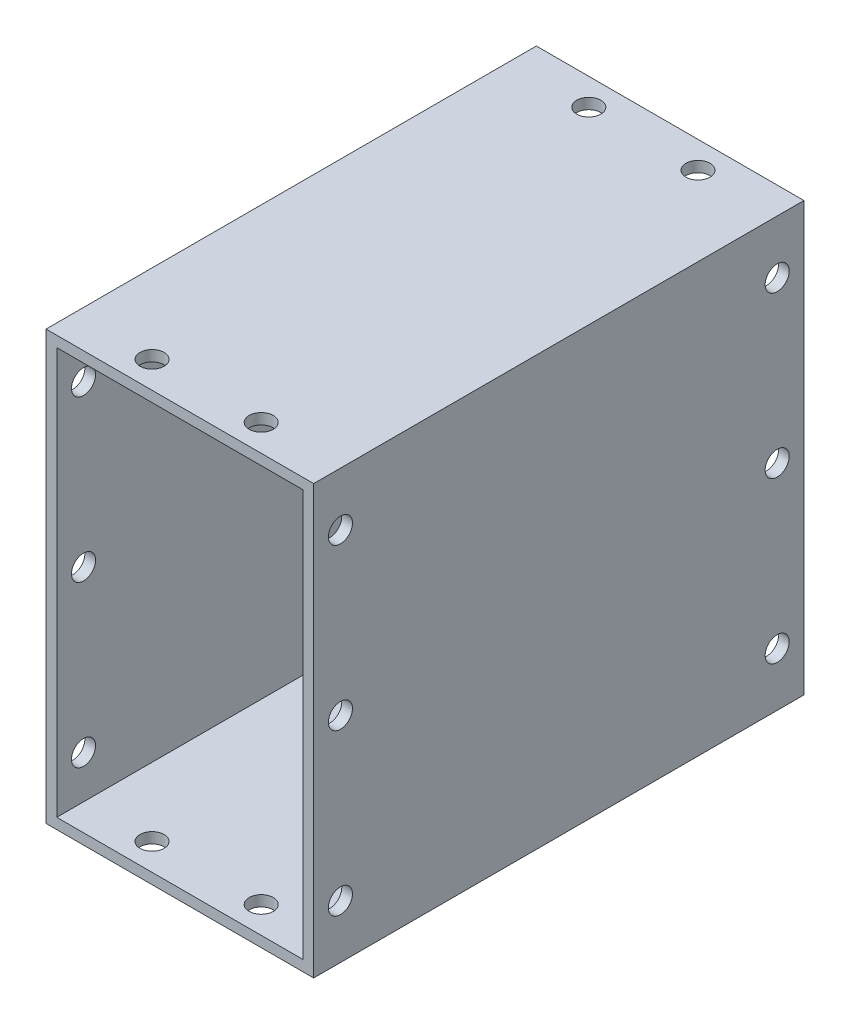
ISO-10303-21;
HEADER;
FILE_DESCRIPTION(('STEP AP214'),'2;1');
FILE_NAME('part.step','',(''),(''),'','','');
FILE_SCHEMA(('AUTOMOTIVE_DESIGN { 1 0 10303 214 1 1 1 1 }'));
ENDSEC;
DATA;
#1=APPLICATION_CONTEXT('core data for automotive mechanical design processes');
#2=APPLICATION_PROTOCOL_DEFINITION('international standard','automotive_design',2000,#1);
#3=PRODUCT_CONTEXT('',#1,'mechanical');
#4=PRODUCT('Part','Part','',(#3));
#5=PRODUCT_RELATED_PRODUCT_CATEGORY('part','',(#4));
#6=PRODUCT_DEFINITION_FORMATION('','',#4);
#7=PRODUCT_DEFINITION_CONTEXT('part definition',#1,'design');
#8=PRODUCT_DEFINITION('design','',#6,#7);
#9=PRODUCT_DEFINITION_SHAPE('','',#8);
#10=(LENGTH_UNIT() NAMED_UNIT(*) SI_UNIT(.MILLI.,.METRE.));
#11=(NAMED_UNIT(*) PLANE_ANGLE_UNIT() SI_UNIT($,.RADIAN.));
#12=(NAMED_UNIT(*) SI_UNIT($,.STERADIAN.) SOLID_ANGLE_UNIT());
#13=UNCERTAINTY_MEASURE_WITH_UNIT(LENGTH_MEASURE(1.E-05),#10,'distance_accuracy_value','');
#14=(GEOMETRIC_REPRESENTATION_CONTEXT(3) GLOBAL_UNCERTAINTY_ASSIGNED_CONTEXT((#13)) GLOBAL_UNIT_ASSIGNED_CONTEXT((#10,
#11,#12)) REPRESENTATION_CONTEXT('',''));
#15=CARTESIAN_POINT('',(0.,0.,0.));
#16=DIRECTION('',(0.,0.,1.));
#17=DIRECTION('',(1.,0.,0.));
#18=AXIS2_PLACEMENT_3D('',#15,#16,#17);
#19=CARTESIAN_POINT('',(25.,40.,151.6));
#20=DIRECTION('',(-1.,0.,0.));
#21=DIRECTION('',(0.,-1.,0.));
#22=AXIS2_PLACEMENT_3D('',#19,#20,#21);
#23=PLANE('',#22);
#24=DIRECTION('',(0.,1.,0.));
#25=VECTOR('',#24,1.);
#26=CARTESIAN_POINT('',(25.,40.,60.));
#27=LINE('',#26,#25);
#28=CARTESIAN_POINT('',(25.,-40.,60.));
#29=VERTEX_POINT('',#28);
#30=CARTESIAN_POINT('',(25.,40.,60.));
#31=VERTEX_POINT('',#30);
#32=EDGE_CURVE('E130',#29,#31,#27,.T.);
#33=ORIENTED_EDGE('',*,*,#32,.T.);
#34=DIRECTION('',(0.,0.,-1.));
#35=VECTOR('',#34,1.);
#36=CARTESIAN_POINT('',(25.,40.,151.6));
#37=LINE('',#36,#35);
#38=CARTESIAN_POINT('',(25.,40.,151.6));
#39=VERTEX_POINT('',#38);
#40=EDGE_CURVE('E11',#39,#31,#37,.T.);
#41=ORIENTED_EDGE('',*,*,#40,.F.);
#42=DIRECTION('',(0.,1.,0.));
#43=VECTOR('',#42,1.);
#44=CARTESIAN_POINT('',(25.,40.,151.6));
#45=LINE('',#44,#43);
#46=CARTESIAN_POINT('',(25.,-40.,151.6));
#47=VERTEX_POINT('',#46);
#48=EDGE_CURVE('E164',#47,#39,#45,.T.);
#49=ORIENTED_EDGE('',*,*,#48,.F.);
#50=DIRECTION('',(0.,0.,-1.));
#51=VECTOR('',#50,1.);
#52=CARTESIAN_POINT('',(25.,-40.,151.6));
#53=LINE('',#52,#51);
#54=EDGE_CURVE('E178',#47,#29,#53,.T.);
#55=ORIENTED_EDGE('',*,*,#54,.T.);
#56=EDGE_LOOP('',(#33,#41,#49,#55));
#57=FACE_BOUND('',#56,.T.);
#58=CARTESIAN_POINT('',(25.,30.,146.6));
#59=DIRECTION('',(1.,0.,0.));
#60=DIRECTION('',(0.,0.,-1.));
#61=AXIS2_PLACEMENT_3D('',#58,#59,#60);
#62=CIRCLE('',#61,2.24999999999999);
#63=CARTESIAN_POINT('',(25.,30.,144.35));
#64=VERTEX_POINT('',#63);
#65=EDGE_CURVE('E328',#64,#64,#62,.T.);
#66=ORIENTED_EDGE('',*,*,#65,.F.);
#67=EDGE_LOOP('',(#66));
#68=FACE_BOUND('',#67,.T.);
#69=CARTESIAN_POINT('',(25.,0.,146.6));
#70=DIRECTION('',(1.,0.,0.));
#71=DIRECTION('',(0.,0.,-1.));
#72=AXIS2_PLACEMENT_3D('',#69,#70,#71);
#73=CIRCLE('',#72,2.24999999999999);
#74=CARTESIAN_POINT('',(25.,0.,144.35));
#75=VERTEX_POINT('',#74);
#76=EDGE_CURVE('E320',#75,#75,#73,.T.);
#77=ORIENTED_EDGE('',*,*,#76,.F.);
#78=EDGE_LOOP('',(#77));
#79=FACE_BOUND('',#78,.T.);
#80=CARTESIAN_POINT('',(25.,-30.,146.6));
#81=DIRECTION('',(1.,0.,0.));
#82=DIRECTION('',(0.,0.,-1.));
#83=AXIS2_PLACEMENT_3D('',#80,#81,#82);
#84=CIRCLE('',#83,2.24999999999999);
#85=CARTESIAN_POINT('',(25.,-30.,144.35));
#86=VERTEX_POINT('',#85);
#87=EDGE_CURVE('E312',#86,#86,#84,.T.);
#88=ORIENTED_EDGE('',*,*,#87,.F.);
#89=EDGE_LOOP('',(#88));
#90=FACE_BOUND('',#89,.T.);
#91=CARTESIAN_POINT('',(25.,-30.,65.));
#92=DIRECTION('',(1.,0.,0.));
#93=DIRECTION('',(0.,0.,-1.));
#94=AXIS2_PLACEMENT_3D('',#91,#92,#93);
#95=CIRCLE('',#94,2.24999999999999);
#96=CARTESIAN_POINT('',(25.,-30.,62.75));
#97=VERTEX_POINT('',#96);
#98=EDGE_CURVE('E435',#97,#97,#95,.T.);
#99=ORIENTED_EDGE('',*,*,#98,.F.);
#100=EDGE_LOOP('',(#99));
#101=FACE_BOUND('',#100,.T.);
#102=CARTESIAN_POINT('',(25.,0.,65.));
#103=DIRECTION('',(1.,0.,0.));
#104=DIRECTION('',(0.,0.,-1.));
#105=AXIS2_PLACEMENT_3D('',#102,#103,#104);
#106=CIRCLE('',#105,2.24999999999999);
#107=CARTESIAN_POINT('',(25.,0.,62.75));
#108=VERTEX_POINT('',#107);
#109=EDGE_CURVE('E439',#108,#108,#106,.T.);
#110=ORIENTED_EDGE('',*,*,#109,.F.);
#111=EDGE_LOOP('',(#110));
#112=FACE_BOUND('',#111,.T.);
#113=CARTESIAN_POINT('',(25.,30.,65.));
#114=DIRECTION('',(1.,0.,0.));
#115=DIRECTION('',(0.,0.,-1.));
#116=AXIS2_PLACEMENT_3D('',#113,#114,#115);
#117=CIRCLE('',#116,2.24999999999999);
#118=CARTESIAN_POINT('',(25.,30.,62.75));
#119=VERTEX_POINT('',#118);
#120=EDGE_CURVE('E442',#119,#119,#117,.T.);
#121=ORIENTED_EDGE('',*,*,#120,.F.);
#122=EDGE_LOOP('',(#121));
#123=FACE_BOUND('',#122,.T.);
#124=ADVANCED_FACE('F47',(#57,#68,#79,#90,#101,#112,#123),#23,.F.);
#125=CARTESIAN_POINT('',(-25.,-40.,151.6));
#126=DIRECTION('',(0.,1.,0.));
#127=DIRECTION('',(0.,0.,1.));
#128=AXIS2_PLACEMENT_3D('',#125,#126,#127);
#129=PLANE('',#128);
#130=DIRECTION('',(1.,0.,0.));
#131=VECTOR('',#130,1.);
#132=CARTESIAN_POINT('',(-25.,-40.,60.));
#133=LINE('',#132,#131);
#134=CARTESIAN_POINT('',(-25.,-40.,60.));
#135=VERTEX_POINT('',#134);
#136=EDGE_CURVE('E169',#135,#29,#133,.T.);
#137=ORIENTED_EDGE('',*,*,#136,.T.);
#138=ORIENTED_EDGE('',*,*,#54,.F.);
#139=DIRECTION('',(1.,0.,0.));
#140=VECTOR('',#139,1.);
#141=CARTESIAN_POINT('',(-25.,-40.,151.6));
#142=LINE('',#141,#140);
#143=CARTESIAN_POINT('',(-25.,-40.,151.6));
#144=VERTEX_POINT('',#143);
#145=EDGE_CURVE('E175',#144,#47,#142,.T.);
#146=ORIENTED_EDGE('',*,*,#145,.F.);
#147=DIRECTION('',(0.,0.,-1.));
#148=VECTOR('',#147,1.);
#149=CARTESIAN_POINT('',(-25.,-40.,151.6));
#150=LINE('',#149,#148);
#151=EDGE_CURVE('E193',#144,#135,#150,.T.);
#152=ORIENTED_EDGE('',*,*,#151,.T.);
#153=EDGE_LOOP('',(#137,#138,#146,#152));
#154=FACE_BOUND('',#153,.T.);
#155=CARTESIAN_POINT('',(10.2,-40.,146.6));
#156=DIRECTION('',(0.,-1.,0.));
#157=DIRECTION('',(0.,0.,-1.));
#158=AXIS2_PLACEMENT_3D('',#155,#156,#157);
#159=CIRCLE('',#158,2.24999999999999);
#160=CARTESIAN_POINT('',(10.2,-40.,144.35));
#161=VERTEX_POINT('',#160);
#162=EDGE_CURVE('E280',#161,#161,#159,.T.);
#163=ORIENTED_EDGE('',*,*,#162,.F.);
#164=EDGE_LOOP('',(#163));
#165=FACE_BOUND('',#164,.T.);
#166=CARTESIAN_POINT('',(-10.2,-40.,146.6));
#167=DIRECTION('',(0.,-1.,0.));
#168=DIRECTION('',(0.,0.,-1.));
#169=AXIS2_PLACEMENT_3D('',#166,#167,#168);
#170=CIRCLE('',#169,2.24999999999999);
#171=CARTESIAN_POINT('',(-10.2,-40.,144.35));
#172=VERTEX_POINT('',#171);
#173=EDGE_CURVE('E272',#172,#172,#170,.T.);
#174=ORIENTED_EDGE('',*,*,#173,.F.);
#175=EDGE_LOOP('',(#174));
#176=FACE_BOUND('',#175,.T.);
#177=CARTESIAN_POINT('',(-10.2,-40.,65.));
#178=DIRECTION('',(0.,-1.,0.));
#179=DIRECTION('',(0.,0.,-1.));
#180=AXIS2_PLACEMENT_3D('',#177,#178,#179);
#181=CIRCLE('',#180,2.24999999999999);
#182=CARTESIAN_POINT('',(-10.2,-40.,62.75));
#183=VERTEX_POINT('',#182);
#184=EDGE_CURVE('E472',#183,#183,#181,.T.);
#185=ORIENTED_EDGE('',*,*,#184,.F.);
#186=EDGE_LOOP('',(#185));
#187=FACE_BOUND('',#186,.T.);
#188=CARTESIAN_POINT('',(10.2,-40.,65.));
#189=DIRECTION('',(0.,-1.,0.));
#190=DIRECTION('',(0.,0.,-1.));
#191=AXIS2_PLACEMENT_3D('',#188,#189,#190);
#192=CIRCLE('',#191,2.24999999999999);
#193=CARTESIAN_POINT('',(10.2,-40.,62.75));
#194=VERTEX_POINT('',#193);
#195=EDGE_CURVE('E464',#194,#194,#192,.T.);
#196=ORIENTED_EDGE('',*,*,#195,.F.);
#197=EDGE_LOOP('',(#196));
#198=FACE_BOUND('',#197,.T.);
#199=ADVANCED_FACE('F214',(#154,#165,#176,#187,#198),#129,.F.);
#200=CARTESIAN_POINT('',(-25.,40.,151.6));
#201=DIRECTION('',(1.,0.,0.));
#202=DIRECTION('',(0.,1.,0.));
#203=AXIS2_PLACEMENT_3D('',#200,#201,#202);
#204=PLANE('',#203);
#205=DIRECTION('',(0.,-1.,0.));
#206=VECTOR('',#205,1.);
#207=CARTESIAN_POINT('',(-25.,40.,60.));
#208=LINE('',#207,#206);
#209=CARTESIAN_POINT('',(-25.,40.,60.));
#210=VERTEX_POINT('',#209);
#211=EDGE_CURVE('E185',#210,#135,#208,.T.);
#212=ORIENTED_EDGE('',*,*,#211,.T.);
#213=ORIENTED_EDGE('',*,*,#151,.F.);
#214=DIRECTION('',(0.,-1.,0.));
#215=VECTOR('',#214,1.);
#216=CARTESIAN_POINT('',(-25.,40.,151.6));
#217=LINE('',#216,#215);
#218=CARTESIAN_POINT('',(-25.,40.,151.6));
#219=VERTEX_POINT('',#218);
#220=EDGE_CURVE('E172',#219,#144,#217,.T.);
#221=ORIENTED_EDGE('',*,*,#220,.F.);
#222=DIRECTION('',(0.,0.,-1.));
#223=VECTOR('',#222,1.);
#224=CARTESIAN_POINT('',(-25.,40.,151.6));
#225=LINE('',#224,#223);
#226=EDGE_CURVE('E55',#219,#210,#225,.T.);
#227=ORIENTED_EDGE('',*,*,#226,.T.);
#228=EDGE_LOOP('',(#212,#213,#221,#227));
#229=FACE_BOUND('',#228,.T.);
#230=CARTESIAN_POINT('',(-25.,-30.,146.6));
#231=DIRECTION('',(-1.,0.,0.));
#232=DIRECTION('',(0.,0.,1.));
#233=AXIS2_PLACEMENT_3D('',#230,#231,#232);
#234=CIRCLE('',#233,2.24999999999999);
#235=CARTESIAN_POINT('',(-25.,-30.,148.85));
#236=VERTEX_POINT('',#235);
#237=EDGE_CURVE('E304',#236,#236,#234,.T.);
#238=ORIENTED_EDGE('',*,*,#237,.F.);
#239=EDGE_LOOP('',(#238));
#240=FACE_BOUND('',#239,.T.);
#241=CARTESIAN_POINT('',(-25.,0.,146.6));
#242=DIRECTION('',(-1.,0.,0.));
#243=DIRECTION('',(0.,0.,1.));
#244=AXIS2_PLACEMENT_3D('',#241,#242,#243);
#245=CIRCLE('',#244,2.24999999999999);
#246=CARTESIAN_POINT('',(-25.,0.,148.85));
#247=VERTEX_POINT('',#246);
#248=EDGE_CURVE('E296',#247,#247,#245,.T.);
#249=ORIENTED_EDGE('',*,*,#248,.F.);
#250=EDGE_LOOP('',(#249));
#251=FACE_BOUND('',#250,.T.);
#252=CARTESIAN_POINT('',(-25.,30.,146.6));
#253=DIRECTION('',(-1.,0.,0.));
#254=DIRECTION('',(0.,0.,1.));
#255=AXIS2_PLACEMENT_3D('',#252,#253,#254);
#256=CIRCLE('',#255,2.24999999999999);
#257=CARTESIAN_POINT('',(-25.,30.,148.85));
#258=VERTEX_POINT('',#257);
#259=EDGE_CURVE('E288',#258,#258,#256,.T.);
#260=ORIENTED_EDGE('',*,*,#259,.F.);
#261=EDGE_LOOP('',(#260));
#262=FACE_BOUND('',#261,.T.);
#263=CARTESIAN_POINT('',(-25.,0.,65.));
#264=DIRECTION('',(-1.,0.,0.));
#265=DIRECTION('',(0.,0.,1.));
#266=AXIS2_PLACEMENT_3D('',#263,#264,#265);
#267=CIRCLE('',#266,2.24999999999999);
#268=CARTESIAN_POINT('',(-25.,0.,67.25));
#269=VERTEX_POINT('',#268);
#270=EDGE_CURVE('E248',#269,#269,#267,.T.);
#271=ORIENTED_EDGE('',*,*,#270,.F.);
#272=EDGE_LOOP('',(#271));
#273=FACE_BOUND('',#272,.T.);
#274=CARTESIAN_POINT('',(-25.,30.,65.));
#275=DIRECTION('',(-1.,0.,0.));
#276=DIRECTION('',(0.,0.,1.));
#277=AXIS2_PLACEMENT_3D('',#274,#275,#276);
#278=CIRCLE('',#277,2.24999999999999);
#279=CARTESIAN_POINT('',(-25.,30.,67.25));
#280=VERTEX_POINT('',#279);
#281=EDGE_CURVE('E488',#280,#280,#278,.T.);
#282=ORIENTED_EDGE('',*,*,#281,.F.);
#283=EDGE_LOOP('',(#282));
#284=FACE_BOUND('',#283,.T.);
#285=CARTESIAN_POINT('',(-25.,-30.,65.));
#286=DIRECTION('',(-1.,0.,0.));
#287=DIRECTION('',(0.,0.,1.));
#288=AXIS2_PLACEMENT_3D('',#285,#286,#287);
#289=CIRCLE('',#288,2.24999999999999);
#290=CARTESIAN_POINT('',(-25.,-30.,67.25));
#291=VERTEX_POINT('',#290);
#292=EDGE_CURVE('E480',#291,#291,#289,.T.);
#293=ORIENTED_EDGE('',*,*,#292,.F.);
#294=EDGE_LOOP('',(#293));
#295=FACE_BOUND('',#294,.T.);
#296=ADVANCED_FACE('F203',(#229,#240,#251,#262,#273,#284,#295),#204,.F.);
#297=CARTESIAN_POINT('',(-25.,40.,151.6));
#298=DIRECTION('',(0.,-1.,0.));
#299=DIRECTION('',(0.,0.,-1.));
#300=AXIS2_PLACEMENT_3D('',#297,#298,#299);
#301=PLANE('',#300);
#302=CARTESIAN_POINT('',(-10.2,40.,146.6));
#303=DIRECTION('',(0.,1.,0.));
#304=DIRECTION('',(0.,0.,1.));
#305=AXIS2_PLACEMENT_3D('',#302,#303,#304);
#306=CIRCLE('',#305,2.24999999999999);
#307=CARTESIAN_POINT('',(-10.2,40.,148.85));
#308=VERTEX_POINT('',#307);
#309=EDGE_CURVE('E264',#308,#308,#306,.T.);
#310=ORIENTED_EDGE('',*,*,#309,.F.);
#311=EDGE_LOOP('',(#310));
#312=FACE_BOUND('',#311,.T.);
#313=DIRECTION('',(-1.,0.,0.));
#314=VECTOR('',#313,1.);
#315=CARTESIAN_POINT('',(-25.,40.,60.));
#316=LINE('',#315,#314);
#317=EDGE_CURVE('E182',#31,#210,#316,.T.);
#318=ORIENTED_EDGE('',*,*,#317,.T.);
#319=ORIENTED_EDGE('',*,*,#226,.F.);
#320=DIRECTION('',(-1.,0.,0.));
#321=VECTOR('',#320,1.);
#322=CARTESIAN_POINT('',(-25.,40.,151.6));
#323=LINE('',#322,#321);
#324=EDGE_CURVE('E168',#39,#219,#323,.T.);
#325=ORIENTED_EDGE('',*,*,#324,.F.);
#326=ORIENTED_EDGE('',*,*,#40,.T.);
#327=EDGE_LOOP('',(#318,#319,#325,#326));
#328=FACE_BOUND('',#327,.T.);
#329=CARTESIAN_POINT('',(10.2,40.,146.6));
#330=DIRECTION('',(0.,1.,0.));
#331=DIRECTION('',(0.,0.,1.));
#332=AXIS2_PLACEMENT_3D('',#329,#330,#331);
#333=CIRCLE('',#332,2.24999999999999);
#334=CARTESIAN_POINT('',(10.2,40.,148.85));
#335=VERTEX_POINT('',#334);
#336=EDGE_CURVE('E229',#335,#335,#333,.T.);
#337=ORIENTED_EDGE('',*,*,#336,.F.);
#338=EDGE_LOOP('',(#337));
#339=FACE_BOUND('',#338,.T.);
#340=CARTESIAN_POINT('',(-10.2,40.,65.));
#341=DIRECTION('',(0.,1.,0.));
#342=DIRECTION('',(0.,0.,1.));
#343=AXIS2_PLACEMENT_3D('',#340,#341,#342);
#344=CIRCLE('',#343,2.24999999999999);
#345=CARTESIAN_POINT('',(-10.2,40.,67.25));
#346=VERTEX_POINT('',#345);
#347=EDGE_CURVE('E233',#346,#346,#344,.T.);
#348=ORIENTED_EDGE('',*,*,#347,.F.);
#349=EDGE_LOOP('',(#348));
#350=FACE_BOUND('',#349,.T.);
#351=CARTESIAN_POINT('',(10.2,40.,65.));
#352=DIRECTION('',(0.,1.,0.));
#353=DIRECTION('',(0.,0.,1.));
#354=AXIS2_PLACEMENT_3D('',#351,#352,#353);
#355=CIRCLE('',#354,2.24999999999999);
#356=CARTESIAN_POINT('',(10.2,40.,67.25));
#357=VERTEX_POINT('',#356);
#358=EDGE_CURVE('E236',#357,#357,#355,.T.);
#359=ORIENTED_EDGE('',*,*,#358,.F.);
#360=EDGE_LOOP('',(#359));
#361=FACE_BOUND('',#360,.T.);
#362=ADVANCED_FACE('F222',(#312,#328,#339,#350,#361),#301,.F.);
#363=CARTESIAN_POINT('',(0.,0.,151.6));
#364=DIRECTION('',(0.,0.,1.));
#365=DIRECTION('',(1.,0.,0.));
#366=AXIS2_PLACEMENT_3D('',#363,#364,#365);
#367=PLANE('',#366);
#368=ORIENTED_EDGE('',*,*,#48,.T.);
#369=ORIENTED_EDGE('',*,*,#324,.T.);
#370=ORIENTED_EDGE('',*,*,#220,.T.);
#371=ORIENTED_EDGE('',*,*,#145,.T.);
#372=EDGE_LOOP('',(#368,#369,#370,#371));
#373=FACE_BOUND('',#372,.T.);
#374=DIRECTION('',(0.,-1.,0.));
#375=VECTOR('',#374,1.);
#376=CARTESIAN_POINT('',(-23.,38.,151.6));
#377=LINE('',#376,#375);
#378=CARTESIAN_POINT('',(-23.,38.,151.6));
#379=VERTEX_POINT('',#378);
#380=CARTESIAN_POINT('',(-23.,-38.,151.6));
#381=VERTEX_POINT('',#380);
#382=EDGE_CURVE('E121',#379,#381,#377,.T.);
#383=ORIENTED_EDGE('',*,*,#382,.F.);
#384=DIRECTION('',(-1.,0.,0.));
#385=VECTOR('',#384,1.);
#386=CARTESIAN_POINT('',(-23.,38.,151.6));
#387=LINE('',#386,#385);
#388=CARTESIAN_POINT('',(23.,38.,151.6));
#389=VERTEX_POINT('',#388);
#390=EDGE_CURVE('E112',#389,#379,#387,.T.);
#391=ORIENTED_EDGE('',*,*,#390,.F.);
#392=DIRECTION('',(0.,1.,0.));
#393=VECTOR('',#392,1.);
#394=CARTESIAN_POINT('',(23.,38.,151.6));
#395=LINE('',#394,#393);
#396=CARTESIAN_POINT('',(23.,-38.,151.6));
#397=VERTEX_POINT('',#396);
#398=EDGE_CURVE('E140',#397,#389,#395,.T.);
#399=ORIENTED_EDGE('',*,*,#398,.F.);
#400=DIRECTION('',(1.,0.,0.));
#401=VECTOR('',#400,1.);
#402=CARTESIAN_POINT('',(-23.,-38.,151.6));
#403=LINE('',#402,#401);
#404=EDGE_CURVE('E135',#381,#397,#403,.T.);
#405=ORIENTED_EDGE('',*,*,#404,.F.);
#406=EDGE_LOOP('',(#383,#391,#399,#405));
#407=FACE_BOUND('',#406,.T.);
#408=ADVANCED_FACE('F134',(#373,#407),#367,.T.);
#409=CARTESIAN_POINT('',(0.,0.,60.));
#410=DIRECTION('',(0.,0.,1.));
#411=DIRECTION('',(1.,0.,0.));
#412=AXIS2_PLACEMENT_3D('',#409,#410,#411);
#413=PLANE('',#412);
#414=ORIENTED_EDGE('',*,*,#32,.F.);
#415=ORIENTED_EDGE('',*,*,#136,.F.);
#416=ORIENTED_EDGE('',*,*,#211,.F.);
#417=ORIENTED_EDGE('',*,*,#317,.F.);
#418=EDGE_LOOP('',(#414,#415,#416,#417));
#419=FACE_BOUND('',#418,.T.);
#420=DIRECTION('',(-1.,0.,0.));
#421=VECTOR('',#420,1.);
#422=CARTESIAN_POINT('',(-23.,38.,60.));
#423=LINE('',#422,#421);
#424=CARTESIAN_POINT('',(23.,38.,60.));
#425=VERTEX_POINT('',#424);
#426=CARTESIAN_POINT('',(-23.,38.,60.));
#427=VERTEX_POINT('',#426);
#428=EDGE_CURVE('E70',#425,#427,#423,.T.);
#429=ORIENTED_EDGE('',*,*,#428,.T.);
#430=DIRECTION('',(0.,-1.,0.));
#431=VECTOR('',#430,1.);
#432=CARTESIAN_POINT('',(-23.,38.,60.));
#433=LINE('',#432,#431);
#434=CARTESIAN_POINT('',(-23.,-38.,60.));
#435=VERTEX_POINT('',#434);
#436=EDGE_CURVE('E128',#427,#435,#433,.T.);
#437=ORIENTED_EDGE('',*,*,#436,.T.);
#438=DIRECTION('',(1.,0.,0.));
#439=VECTOR('',#438,1.);
#440=CARTESIAN_POINT('',(-23.,-38.,60.));
#441=LINE('',#440,#439);
#442=CARTESIAN_POINT('',(23.,-38.,60.));
#443=VERTEX_POINT('',#442);
#444=EDGE_CURVE('E151',#435,#443,#441,.T.);
#445=ORIENTED_EDGE('',*,*,#444,.T.);
#446=DIRECTION('',(0.,1.,0.));
#447=VECTOR('',#446,1.);
#448=CARTESIAN_POINT('',(23.,38.,60.));
#449=LINE('',#448,#447);
#450=EDGE_CURVE('E122',#443,#425,#449,.T.);
#451=ORIENTED_EDGE('',*,*,#450,.T.);
#452=EDGE_LOOP('',(#429,#437,#445,#451));
#453=FACE_BOUND('',#452,.T.);
#454=ADVANCED_FACE('F210',(#419,#453),#413,.F.);
#455=CARTESIAN_POINT('',(-23.,38.,151.6));
#456=DIRECTION('',(0.,-1.,0.));
#457=DIRECTION('',(0.,0.,-1.));
#458=AXIS2_PLACEMENT_3D('',#455,#456,#457);
#459=PLANE('',#458);
#460=CARTESIAN_POINT('',(10.2,38.,65.));
#461=DIRECTION('',(0.,-1.,0.));
#462=DIRECTION('',(0.,0.,-1.));
#463=AXIS2_PLACEMENT_3D('',#460,#461,#462);
#464=CIRCLE('',#463,2.24999999999999);
#465=CARTESIAN_POINT('',(10.2,38.,62.75));
#466=VERTEX_POINT('',#465);
#467=EDGE_CURVE('E239',#466,#466,#464,.T.);
#468=ORIENTED_EDGE('',*,*,#467,.F.);
#469=EDGE_LOOP('',(#468));
#470=FACE_BOUND('',#469,.T.);
#471=CARTESIAN_POINT('',(-10.2,38.,65.));
#472=DIRECTION('',(0.,-1.,0.));
#473=DIRECTION('',(0.,0.,-1.));
#474=AXIS2_PLACEMENT_3D('',#471,#472,#473);
#475=CIRCLE('',#474,2.24999999999999);
#476=CARTESIAN_POINT('',(-10.2,38.,62.75));
#477=VERTEX_POINT('',#476);
#478=EDGE_CURVE('E254',#477,#477,#475,.T.);
#479=ORIENTED_EDGE('',*,*,#478,.F.);
#480=EDGE_LOOP('',(#479));
#481=FACE_BOUND('',#480,.T.);
#482=CARTESIAN_POINT('',(10.2,38.,146.6));
#483=DIRECTION('',(0.,-1.,0.));
#484=DIRECTION('',(0.,0.,-1.));
#485=AXIS2_PLACEMENT_3D('',#482,#483,#484);
#486=CIRCLE('',#485,2.24999999999999);
#487=CARTESIAN_POINT('',(10.2,38.,144.35));
#488=VERTEX_POINT('',#487);
#489=EDGE_CURVE('E260',#488,#488,#486,.T.);
#490=ORIENTED_EDGE('',*,*,#489,.F.);
#491=EDGE_LOOP('',(#490));
#492=FACE_BOUND('',#491,.T.);
#493=CARTESIAN_POINT('',(-10.2,38.,146.6));
#494=DIRECTION('',(0.,-1.,0.));
#495=DIRECTION('',(0.,0.,-1.));
#496=AXIS2_PLACEMENT_3D('',#493,#494,#495);
#497=CIRCLE('',#496,2.24999999999999);
#498=CARTESIAN_POINT('',(-10.2,38.,144.35));
#499=VERTEX_POINT('',#498);
#500=EDGE_CURVE('E268',#499,#499,#497,.T.);
#501=ORIENTED_EDGE('',*,*,#500,.F.);
#502=EDGE_LOOP('',(#501));
#503=FACE_BOUND('',#502,.T.);
#504=ORIENTED_EDGE('',*,*,#428,.F.);
#505=DIRECTION('',(0.,0.,-1.));
#506=VECTOR('',#505,1.);
#507=CARTESIAN_POINT('',(23.,38.,151.6));
#508=LINE('',#507,#506);
#509=EDGE_CURVE('E116',#389,#425,#508,.T.);
#510=ORIENTED_EDGE('',*,*,#509,.F.);
#511=ORIENTED_EDGE('',*,*,#390,.T.);
#512=DIRECTION('',(0.,0.,-1.));
#513=VECTOR('',#512,1.);
#514=CARTESIAN_POINT('',(-23.,38.,151.6));
#515=LINE('',#514,#513);
#516=EDGE_CURVE('E115',#379,#427,#515,.T.);
#517=ORIENTED_EDGE('',*,*,#516,.T.);
#518=EDGE_LOOP('',(#504,#510,#511,#517));
#519=FACE_BOUND('',#518,.T.);
#520=ADVANCED_FACE('F114',(#470,#481,#492,#503,#519),#459,.T.);
#521=CARTESIAN_POINT('',(-23.,38.,151.6));
#522=DIRECTION('',(1.,0.,0.));
#523=DIRECTION('',(0.,1.,0.));
#524=AXIS2_PLACEMENT_3D('',#521,#522,#523);
#525=PLANE('',#524);
#526=CARTESIAN_POINT('',(-23.,-30.,65.));
#527=DIRECTION('',(1.,0.,0.));
#528=DIRECTION('',(0.,1.,0.));
#529=AXIS2_PLACEMENT_3D('',#526,#527,#528);
#530=CIRCLE('',#529,2.24999999999999);
#531=CARTESIAN_POINT('',(-23.,-27.75,65.));
#532=VERTEX_POINT('',#531);
#533=EDGE_CURVE('E484',#532,#532,#530,.T.);
#534=ORIENTED_EDGE('',*,*,#533,.F.);
#535=EDGE_LOOP('',(#534));
#536=FACE_BOUND('',#535,.T.);
#537=CARTESIAN_POINT('',(-23.,30.,65.));
#538=DIRECTION('',(1.,0.,0.));
#539=DIRECTION('',(0.,1.,0.));
#540=AXIS2_PLACEMENT_3D('',#537,#538,#539);
#541=CIRCLE('',#540,2.25);
#542=CARTESIAN_POINT('',(-23.,32.25,65.));
#543=VERTEX_POINT('',#542);
#544=EDGE_CURVE('E492',#543,#543,#541,.T.);
#545=ORIENTED_EDGE('',*,*,#544,.F.);
#546=EDGE_LOOP('',(#545));
#547=FACE_BOUND('',#546,.T.);
#548=CARTESIAN_POINT('',(-23.,0.,65.));
#549=DIRECTION('',(1.,0.,0.));
#550=DIRECTION('',(0.,1.,0.));
#551=AXIS2_PLACEMENT_3D('',#548,#549,#550);
#552=CIRCLE('',#551,2.24999999999999);
#553=CARTESIAN_POINT('',(-23.,2.24999999999999,65.));
#554=VERTEX_POINT('',#553);
#555=EDGE_CURVE('E240',#554,#554,#552,.T.);
#556=ORIENTED_EDGE('',*,*,#555,.F.);
#557=EDGE_LOOP('',(#556));
#558=FACE_BOUND('',#557,.T.);
#559=CARTESIAN_POINT('',(-23.,30.,146.6));
#560=DIRECTION('',(1.,0.,0.));
#561=DIRECTION('',(0.,1.,0.));
#562=AXIS2_PLACEMENT_3D('',#559,#560,#561);
#563=CIRCLE('',#562,2.25);
#564=CARTESIAN_POINT('',(-23.,32.25,146.6));
#565=VERTEX_POINT('',#564);
#566=EDGE_CURVE('E292',#565,#565,#563,.T.);
#567=ORIENTED_EDGE('',*,*,#566,.F.);
#568=EDGE_LOOP('',(#567));
#569=FACE_BOUND('',#568,.T.);
#570=CARTESIAN_POINT('',(-23.,0.,146.6));
#571=DIRECTION('',(1.,0.,0.));
#572=DIRECTION('',(0.,1.,0.));
#573=AXIS2_PLACEMENT_3D('',#570,#571,#572);
#574=CIRCLE('',#573,2.24999999999999);
#575=CARTESIAN_POINT('',(-23.,2.24999999999999,146.6));
#576=VERTEX_POINT('',#575);
#577=EDGE_CURVE('E300',#576,#576,#574,.T.);
#578=ORIENTED_EDGE('',*,*,#577,.F.);
#579=EDGE_LOOP('',(#578));
#580=FACE_BOUND('',#579,.T.);
#581=CARTESIAN_POINT('',(-23.,-30.,146.6));
#582=DIRECTION('',(1.,0.,0.));
#583=DIRECTION('',(0.,1.,0.));
#584=AXIS2_PLACEMENT_3D('',#581,#582,#583);
#585=CIRCLE('',#584,2.24999999999999);
#586=CARTESIAN_POINT('',(-23.,-27.75,146.6));
#587=VERTEX_POINT('',#586);
#588=EDGE_CURVE('E308',#587,#587,#585,.T.);
#589=ORIENTED_EDGE('',*,*,#588,.F.);
#590=EDGE_LOOP('',(#589));
#591=FACE_BOUND('',#590,.T.);
#592=ORIENTED_EDGE('',*,*,#436,.F.);
#593=ORIENTED_EDGE('',*,*,#516,.F.);
#594=ORIENTED_EDGE('',*,*,#382,.T.);
#595=DIRECTION('',(0.,0.,-1.));
#596=VECTOR('',#595,1.);
#597=CARTESIAN_POINT('',(-23.,-38.,151.6));
#598=LINE('',#597,#596);
#599=EDGE_CURVE('E131',#381,#435,#598,.T.);
#600=ORIENTED_EDGE('',*,*,#599,.T.);
#601=EDGE_LOOP('',(#592,#593,#594,#600));
#602=FACE_BOUND('',#601,.T.);
#603=ADVANCED_FACE('F125',(#536,#547,#558,#569,#580,#591,#602),#525,.T.);
#604=CARTESIAN_POINT('',(-23.,-38.,151.6));
#605=DIRECTION('',(0.,1.,0.));
#606=DIRECTION('',(-1.,0.,0.));
#607=AXIS2_PLACEMENT_3D('',#604,#605,#606);
#608=PLANE('',#607);
#609=CARTESIAN_POINT('',(10.2,-38.,65.));
#610=DIRECTION('',(0.,1.,0.));
#611=DIRECTION('',(-1.,0.,0.));
#612=AXIS2_PLACEMENT_3D('',#609,#610,#611);
#613=CIRCLE('',#612,2.24999999999999);
#614=CARTESIAN_POINT('',(7.95000000000001,-38.,65.));
#615=VERTEX_POINT('',#614);
#616=EDGE_CURVE('E468',#615,#615,#613,.T.);
#617=ORIENTED_EDGE('',*,*,#616,.F.);
#618=EDGE_LOOP('',(#617));
#619=FACE_BOUND('',#618,.T.);
#620=CARTESIAN_POINT('',(-10.2,-38.,65.));
#621=DIRECTION('',(0.,1.,0.));
#622=DIRECTION('',(-1.,0.,0.));
#623=AXIS2_PLACEMENT_3D('',#620,#621,#622);
#624=CIRCLE('',#623,2.24999999999999);
#625=CARTESIAN_POINT('',(-12.45,-38.,65.));
#626=VERTEX_POINT('',#625);
#627=EDGE_CURVE('E476',#626,#626,#624,.T.);
#628=ORIENTED_EDGE('',*,*,#627,.F.);
#629=EDGE_LOOP('',(#628));
#630=FACE_BOUND('',#629,.T.);
#631=CARTESIAN_POINT('',(-10.2,-38.,146.6));
#632=DIRECTION('',(0.,1.,0.));
#633=DIRECTION('',(-1.,0.,0.));
#634=AXIS2_PLACEMENT_3D('',#631,#632,#633);
#635=CIRCLE('',#634,2.24999999999999);
#636=CARTESIAN_POINT('',(-12.45,-38.,146.6));
#637=VERTEX_POINT('',#636);
#638=EDGE_CURVE('E276',#637,#637,#635,.T.);
#639=ORIENTED_EDGE('',*,*,#638,.F.);
#640=EDGE_LOOP('',(#639));
#641=FACE_BOUND('',#640,.T.);
#642=CARTESIAN_POINT('',(10.2,-38.,146.6));
#643=DIRECTION('',(0.,1.,0.));
#644=DIRECTION('',(-1.,0.,0.));
#645=AXIS2_PLACEMENT_3D('',#642,#643,#644);
#646=CIRCLE('',#645,2.24999999999999);
#647=CARTESIAN_POINT('',(7.95000000000002,-38.,146.6));
#648=VERTEX_POINT('',#647);
#649=EDGE_CURVE('E284',#648,#648,#646,.T.);
#650=ORIENTED_EDGE('',*,*,#649,.F.);
#651=EDGE_LOOP('',(#650));
#652=FACE_BOUND('',#651,.T.);
#653=ORIENTED_EDGE('',*,*,#444,.F.);
#654=ORIENTED_EDGE('',*,*,#599,.F.);
#655=ORIENTED_EDGE('',*,*,#404,.T.);
#656=DIRECTION('',(0.,0.,-1.));
#657=VECTOR('',#656,1.);
#658=CARTESIAN_POINT('',(23.,-38.,151.6));
#659=LINE('',#658,#657);
#660=EDGE_CURVE('E62',#397,#443,#659,.T.);
#661=ORIENTED_EDGE('',*,*,#660,.T.);
#662=EDGE_LOOP('',(#653,#654,#655,#661));
#663=FACE_BOUND('',#662,.T.);
#664=ADVANCED_FACE('F340',(#619,#630,#641,#652,#663),#608,.T.);
#665=CARTESIAN_POINT('',(23.,38.,151.6));
#666=DIRECTION('',(-1.,0.,0.));
#667=DIRECTION('',(0.,-1.,0.));
#668=AXIS2_PLACEMENT_3D('',#665,#666,#667);
#669=PLANE('',#668);
#670=CARTESIAN_POINT('',(23.,30.,65.));
#671=DIRECTION('',(-1.,0.,0.));
#672=DIRECTION('',(0.,-1.,0.));
#673=AXIS2_PLACEMENT_3D('',#670,#671,#672);
#674=CIRCLE('',#673,2.25);
#675=CARTESIAN_POINT('',(23.,27.75,65.));
#676=VERTEX_POINT('',#675);
#677=EDGE_CURVE('E445',#676,#676,#674,.T.);
#678=ORIENTED_EDGE('',*,*,#677,.F.);
#679=EDGE_LOOP('',(#678));
#680=FACE_BOUND('',#679,.T.);
#681=CARTESIAN_POINT('',(23.,0.,65.));
#682=DIRECTION('',(-1.,0.,0.));
#683=DIRECTION('',(0.,-1.,0.));
#684=AXIS2_PLACEMENT_3D('',#681,#682,#683);
#685=CIRCLE('',#684,2.24999999999999);
#686=CARTESIAN_POINT('',(23.,-2.25,65.));
#687=VERTEX_POINT('',#686);
#688=EDGE_CURVE('E454',#687,#687,#685,.T.);
#689=ORIENTED_EDGE('',*,*,#688,.F.);
#690=EDGE_LOOP('',(#689));
#691=FACE_BOUND('',#690,.T.);
#692=CARTESIAN_POINT('',(23.,-30.,65.));
#693=DIRECTION('',(-1.,0.,0.));
#694=DIRECTION('',(0.,-1.,0.));
#695=AXIS2_PLACEMENT_3D('',#692,#693,#694);
#696=CIRCLE('',#695,2.24999999999999);
#697=CARTESIAN_POINT('',(23.,-32.25,65.));
#698=VERTEX_POINT('',#697);
#699=EDGE_CURVE('E460',#698,#698,#696,.T.);
#700=ORIENTED_EDGE('',*,*,#699,.F.);
#701=EDGE_LOOP('',(#700));
#702=FACE_BOUND('',#701,.T.);
#703=CARTESIAN_POINT('',(23.,-30.,146.6));
#704=DIRECTION('',(-1.,0.,0.));
#705=DIRECTION('',(0.,-1.,0.));
#706=AXIS2_PLACEMENT_3D('',#703,#704,#705);
#707=CIRCLE('',#706,2.24999999999999);
#708=CARTESIAN_POINT('',(23.,-32.25,146.6));
#709=VERTEX_POINT('',#708);
#710=EDGE_CURVE('E316',#709,#709,#707,.T.);
#711=ORIENTED_EDGE('',*,*,#710,.F.);
#712=EDGE_LOOP('',(#711));
#713=FACE_BOUND('',#712,.T.);
#714=CARTESIAN_POINT('',(23.,0.,146.6));
#715=DIRECTION('',(-1.,0.,0.));
#716=DIRECTION('',(0.,-1.,0.));
#717=AXIS2_PLACEMENT_3D('',#714,#715,#716);
#718=CIRCLE('',#717,2.24999999999999);
#719=CARTESIAN_POINT('',(23.,-2.24999999999999,146.6));
#720=VERTEX_POINT('',#719);
#721=EDGE_CURVE('E324',#720,#720,#718,.T.);
#722=ORIENTED_EDGE('',*,*,#721,.F.);
#723=EDGE_LOOP('',(#722));
#724=FACE_BOUND('',#723,.T.);
#725=CARTESIAN_POINT('',(23.,30.,146.6));
#726=DIRECTION('',(-1.,0.,0.));
#727=DIRECTION('',(0.,-1.,0.));
#728=AXIS2_PLACEMENT_3D('',#725,#726,#727);
#729=CIRCLE('',#728,2.25);
#730=CARTESIAN_POINT('',(23.,27.75,146.6));
#731=VERTEX_POINT('',#730);
#732=EDGE_CURVE('E148',#731,#731,#729,.T.);
#733=ORIENTED_EDGE('',*,*,#732,.F.);
#734=EDGE_LOOP('',(#733));
#735=FACE_BOUND('',#734,.T.);
#736=ORIENTED_EDGE('',*,*,#450,.F.);
#737=ORIENTED_EDGE('',*,*,#660,.F.);
#738=ORIENTED_EDGE('',*,*,#398,.T.);
#739=ORIENTED_EDGE('',*,*,#509,.T.);
#740=EDGE_LOOP('',(#736,#737,#738,#739));
#741=FACE_BOUND('',#740,.T.);
#742=ADVANCED_FACE('F338',(#680,#691,#702,#713,#724,#735,#741),#669,.T.);
#743=CARTESIAN_POINT('',(25.,30.,146.6));
#744=DIRECTION('',(1.,0.,0.));
#745=DIRECTION('',(0.,0.,-1.));
#746=AXIS2_PLACEMENT_3D('',#743,#744,#745);
#747=CYLINDRICAL_SURFACE('',#746,2.25);
#748=ORIENTED_EDGE('',*,*,#65,.T.);
#749=EDGE_LOOP('',(#748));
#750=FACE_BOUND('',#749,.T.);
#751=ORIENTED_EDGE('',*,*,#732,.T.);
#752=EDGE_LOOP('',(#751));
#753=FACE_BOUND('',#752,.T.);
#754=ADVANCED_FACE('F336',(#750,#753),#747,.F.);
#755=CARTESIAN_POINT('',(25.,0.,146.6));
#756=DIRECTION('',(1.,0.,0.));
#757=DIRECTION('',(0.,0.,-1.));
#758=AXIS2_PLACEMENT_3D('',#755,#756,#757);
#759=CYLINDRICAL_SURFACE('',#758,2.24999999999999);
#760=ORIENTED_EDGE('',*,*,#76,.T.);
#761=EDGE_LOOP('',(#760));
#762=FACE_BOUND('',#761,.T.);
#763=ORIENTED_EDGE('',*,*,#721,.T.);
#764=EDGE_LOOP('',(#763));
#765=FACE_BOUND('',#764,.T.);
#766=ADVANCED_FACE('F417',(#762,#765),#759,.F.);
#767=CARTESIAN_POINT('',(25.,-30.,146.6));
#768=DIRECTION('',(1.,0.,0.));
#769=DIRECTION('',(0.,0.,-1.));
#770=AXIS2_PLACEMENT_3D('',#767,#768,#769);
#771=CYLINDRICAL_SURFACE('',#770,2.24999999999999);
#772=ORIENTED_EDGE('',*,*,#87,.T.);
#773=EDGE_LOOP('',(#772));
#774=FACE_BOUND('',#773,.T.);
#775=ORIENTED_EDGE('',*,*,#710,.T.);
#776=EDGE_LOOP('',(#775));
#777=FACE_BOUND('',#776,.T.);
#778=ADVANCED_FACE('F413',(#774,#777),#771,.F.);
#779=CARTESIAN_POINT('',(-25.,-30.,146.6));
#780=DIRECTION('',(-1.,0.,0.));
#781=DIRECTION('',(0.,0.,1.));
#782=AXIS2_PLACEMENT_3D('',#779,#780,#781);
#783=CYLINDRICAL_SURFACE('',#782,2.24999999999999);
#784=ORIENTED_EDGE('',*,*,#237,.T.);
#785=EDGE_LOOP('',(#784));
#786=FACE_BOUND('',#785,.T.);
#787=ORIENTED_EDGE('',*,*,#588,.T.);
#788=EDGE_LOOP('',(#787));
#789=FACE_BOUND('',#788,.T.);
#790=ADVANCED_FACE('F409',(#786,#789),#783,.F.);
#791=CARTESIAN_POINT('',(-25.,0.,146.6));
#792=DIRECTION('',(-1.,0.,0.));
#793=DIRECTION('',(0.,0.,1.));
#794=AXIS2_PLACEMENT_3D('',#791,#792,#793);
#795=CYLINDRICAL_SURFACE('',#794,2.24999999999999);
#796=ORIENTED_EDGE('',*,*,#248,.T.);
#797=EDGE_LOOP('',(#796));
#798=FACE_BOUND('',#797,.T.);
#799=ORIENTED_EDGE('',*,*,#577,.T.);
#800=EDGE_LOOP('',(#799));
#801=FACE_BOUND('',#800,.T.);
#802=ADVANCED_FACE('F405',(#798,#801),#795,.F.);
#803=CARTESIAN_POINT('',(-25.,30.,146.6));
#804=DIRECTION('',(-1.,0.,0.));
#805=DIRECTION('',(0.,0.,1.));
#806=AXIS2_PLACEMENT_3D('',#803,#804,#805);
#807=CYLINDRICAL_SURFACE('',#806,2.25);
#808=ORIENTED_EDGE('',*,*,#259,.T.);
#809=EDGE_LOOP('',(#808));
#810=FACE_BOUND('',#809,.T.);
#811=ORIENTED_EDGE('',*,*,#566,.T.);
#812=EDGE_LOOP('',(#811));
#813=FACE_BOUND('',#812,.T.);
#814=ADVANCED_FACE('F401',(#810,#813),#807,.F.);
#815=CARTESIAN_POINT('',(10.2,-40.,146.6));
#816=DIRECTION('',(0.,-1.,0.));
#817=DIRECTION('',(0.,0.,-1.));
#818=AXIS2_PLACEMENT_3D('',#815,#816,#817);
#819=CYLINDRICAL_SURFACE('',#818,2.24999999999999);
#820=ORIENTED_EDGE('',*,*,#162,.T.);
#821=EDGE_LOOP('',(#820));
#822=FACE_BOUND('',#821,.T.);
#823=ORIENTED_EDGE('',*,*,#649,.T.);
#824=EDGE_LOOP('',(#823));
#825=FACE_BOUND('',#824,.T.);
#826=ADVANCED_FACE('F394',(#822,#825),#819,.F.);
#827=CARTESIAN_POINT('',(-10.2,-40.,146.6));
#828=DIRECTION('',(0.,-1.,0.));
#829=DIRECTION('',(0.,0.,-1.));
#830=AXIS2_PLACEMENT_3D('',#827,#828,#829);
#831=CYLINDRICAL_SURFACE('',#830,2.24999999999999);
#832=ORIENTED_EDGE('',*,*,#173,.T.);
#833=EDGE_LOOP('',(#832));
#834=FACE_BOUND('',#833,.T.);
#835=ORIENTED_EDGE('',*,*,#638,.T.);
#836=EDGE_LOOP('',(#835));
#837=FACE_BOUND('',#836,.T.);
#838=ADVANCED_FACE('F384',(#834,#837),#831,.F.);
#839=CARTESIAN_POINT('',(-10.2,40.,146.6));
#840=DIRECTION('',(0.,1.,0.));
#841=DIRECTION('',(0.,0.,1.));
#842=AXIS2_PLACEMENT_3D('',#839,#840,#841);
#843=CYLINDRICAL_SURFACE('',#842,2.24999999999999);
#844=ORIENTED_EDGE('',*,*,#309,.T.);
#845=EDGE_LOOP('',(#844));
#846=FACE_BOUND('',#845,.T.);
#847=ORIENTED_EDGE('',*,*,#500,.T.);
#848=EDGE_LOOP('',(#847));
#849=FACE_BOUND('',#848,.T.);
#850=ADVANCED_FACE('F381',(#846,#849),#843,.F.);
#851=CARTESIAN_POINT('',(10.2,40.,146.6));
#852=DIRECTION('',(0.,1.,0.));
#853=DIRECTION('',(0.,0.,1.));
#854=AXIS2_PLACEMENT_3D('',#851,#852,#853);
#855=CYLINDRICAL_SURFACE('',#854,2.24999999999999);
#856=ORIENTED_EDGE('',*,*,#336,.T.);
#857=EDGE_LOOP('',(#856));
#858=FACE_BOUND('',#857,.T.);
#859=ORIENTED_EDGE('',*,*,#489,.T.);
#860=EDGE_LOOP('',(#859));
#861=FACE_BOUND('',#860,.T.);
#862=ADVANCED_FACE('F383',(#858,#861),#855,.F.);
#863=CARTESIAN_POINT('',(-10.2,40.,65.));
#864=DIRECTION('',(0.,1.,0.));
#865=DIRECTION('',(0.,0.,1.));
#866=AXIS2_PLACEMENT_3D('',#863,#864,#865);
#867=CYLINDRICAL_SURFACE('',#866,2.24999999999999);
#868=ORIENTED_EDGE('',*,*,#347,.T.);
#869=EDGE_LOOP('',(#868));
#870=FACE_BOUND('',#869,.T.);
#871=ORIENTED_EDGE('',*,*,#478,.T.);
#872=EDGE_LOOP('',(#871));
#873=FACE_BOUND('',#872,.T.);
#874=ADVANCED_FACE('F391',(#870,#873),#867,.F.);
#875=CARTESIAN_POINT('',(10.2,40.,65.));
#876=DIRECTION('',(0.,1.,0.));
#877=DIRECTION('',(0.,0.,1.));
#878=AXIS2_PLACEMENT_3D('',#875,#876,#877);
#879=CYLINDRICAL_SURFACE('',#878,2.24999999999999);
#880=ORIENTED_EDGE('',*,*,#358,.T.);
#881=EDGE_LOOP('',(#880));
#882=FACE_BOUND('',#881,.T.);
#883=ORIENTED_EDGE('',*,*,#467,.T.);
#884=EDGE_LOOP('',(#883));
#885=FACE_BOUND('',#884,.T.);
#886=ADVANCED_FACE('F529',(#882,#885),#879,.F.);
#887=CARTESIAN_POINT('',(-25.,0.,65.));
#888=DIRECTION('',(-1.,0.,0.));
#889=DIRECTION('',(0.,0.,1.));
#890=AXIS2_PLACEMENT_3D('',#887,#888,#889);
#891=CYLINDRICAL_SURFACE('',#890,2.24999999999999);
#892=ORIENTED_EDGE('',*,*,#270,.T.);
#893=EDGE_LOOP('',(#892));
#894=FACE_BOUND('',#893,.T.);
#895=ORIENTED_EDGE('',*,*,#555,.T.);
#896=EDGE_LOOP('',(#895));
#897=FACE_BOUND('',#896,.T.);
#898=ADVANCED_FACE('F500',(#894,#897),#891,.F.);
#899=CARTESIAN_POINT('',(-25.,30.,65.));
#900=DIRECTION('',(-1.,0.,0.));
#901=DIRECTION('',(0.,0.,1.));
#902=AXIS2_PLACEMENT_3D('',#899,#900,#901);
#903=CYLINDRICAL_SURFACE('',#902,2.25);
#904=ORIENTED_EDGE('',*,*,#281,.T.);
#905=EDGE_LOOP('',(#904));
#906=FACE_BOUND('',#905,.T.);
#907=ORIENTED_EDGE('',*,*,#544,.T.);
#908=EDGE_LOOP('',(#907));
#909=FACE_BOUND('',#908,.T.);
#910=ADVANCED_FACE('F512',(#906,#909),#903,.F.);
#911=CARTESIAN_POINT('',(-25.,-30.,65.));
#912=DIRECTION('',(-1.,0.,0.));
#913=DIRECTION('',(0.,0.,1.));
#914=AXIS2_PLACEMENT_3D('',#911,#912,#913);
#915=CYLINDRICAL_SURFACE('',#914,2.24999999999999);
#916=ORIENTED_EDGE('',*,*,#292,.T.);
#917=EDGE_LOOP('',(#916));
#918=FACE_BOUND('',#917,.T.);
#919=ORIENTED_EDGE('',*,*,#533,.T.);
#920=EDGE_LOOP('',(#919));
#921=FACE_BOUND('',#920,.T.);
#922=ADVANCED_FACE('F508',(#918,#921),#915,.F.);
#923=CARTESIAN_POINT('',(-10.2,-40.,65.));
#924=DIRECTION('',(0.,-1.,0.));
#925=DIRECTION('',(0.,0.,-1.));
#926=AXIS2_PLACEMENT_3D('',#923,#924,#925);
#927=CYLINDRICAL_SURFACE('',#926,2.24999999999999);
#928=ORIENTED_EDGE('',*,*,#184,.T.);
#929=EDGE_LOOP('',(#928));
#930=FACE_BOUND('',#929,.T.);
#931=ORIENTED_EDGE('',*,*,#627,.T.);
#932=EDGE_LOOP('',(#931));
#933=FACE_BOUND('',#932,.T.);
#934=ADVANCED_FACE('F511',(#930,#933),#927,.F.);
#935=CARTESIAN_POINT('',(10.2,-40.,65.));
#936=DIRECTION('',(0.,-1.,0.));
#937=DIRECTION('',(0.,0.,-1.));
#938=AXIS2_PLACEMENT_3D('',#935,#936,#937);
#939=CYLINDRICAL_SURFACE('',#938,2.24999999999999);
#940=ORIENTED_EDGE('',*,*,#195,.T.);
#941=EDGE_LOOP('',(#940));
#942=FACE_BOUND('',#941,.T.);
#943=ORIENTED_EDGE('',*,*,#616,.T.);
#944=EDGE_LOOP('',(#943));
#945=FACE_BOUND('',#944,.T.);
#946=ADVANCED_FACE('F576',(#942,#945),#939,.F.);
#947=CARTESIAN_POINT('',(25.,-30.,65.));
#948=DIRECTION('',(1.,0.,0.));
#949=DIRECTION('',(0.,0.,-1.));
#950=AXIS2_PLACEMENT_3D('',#947,#948,#949);
#951=CYLINDRICAL_SURFACE('',#950,2.24999999999999);
#952=ORIENTED_EDGE('',*,*,#98,.T.);
#953=EDGE_LOOP('',(#952));
#954=FACE_BOUND('',#953,.T.);
#955=ORIENTED_EDGE('',*,*,#699,.T.);
#956=EDGE_LOOP('',(#955));
#957=FACE_BOUND('',#956,.T.);
#958=ADVANCED_FACE('F586',(#954,#957),#951,.F.);
#959=CARTESIAN_POINT('',(25.,0.,65.));
#960=DIRECTION('',(1.,0.,0.));
#961=DIRECTION('',(0.,0.,-1.));
#962=AXIS2_PLACEMENT_3D('',#959,#960,#961);
#963=CYLINDRICAL_SURFACE('',#962,2.24999999999999);
#964=ORIENTED_EDGE('',*,*,#109,.T.);
#965=EDGE_LOOP('',(#964));
#966=FACE_BOUND('',#965,.T.);
#967=ORIENTED_EDGE('',*,*,#688,.T.);
#968=EDGE_LOOP('',(#967));
#969=FACE_BOUND('',#968,.T.);
#970=ADVANCED_FACE('F596',(#966,#969),#963,.F.);
#971=CARTESIAN_POINT('',(25.,30.,65.));
#972=DIRECTION('',(1.,0.,0.));
#973=DIRECTION('',(0.,0.,-1.));
#974=AXIS2_PLACEMENT_3D('',#971,#972,#973);
#975=CYLINDRICAL_SURFACE('',#974,2.25);
#976=ORIENTED_EDGE('',*,*,#120,.T.);
#977=EDGE_LOOP('',(#976));
#978=FACE_BOUND('',#977,.T.);
#979=ORIENTED_EDGE('',*,*,#677,.T.);
#980=EDGE_LOOP('',(#979));
#981=FACE_BOUND('',#980,.T.);
#982=ADVANCED_FACE('F606',(#978,#981),#975,.F.);
#983=CLOSED_SHELL('',(#124,#199,#296,#362,#408,#454,#520,#603,#664,#742,#754,#766,#778,#790,
#802,#814,#826,#838,#850,#862,#874,#886,#898,#910,#922,#934,#946,#958,#970,#982));
#984=MANIFOLD_SOLID_BREP('B2',#983);
#985=ADVANCED_BREP_SHAPE_REPRESENTATION('',(#18,#984),#14);
#986=SHAPE_DEFINITION_REPRESENTATION(#9,#985);
ENDSEC;
END-ISO-10303-21;
